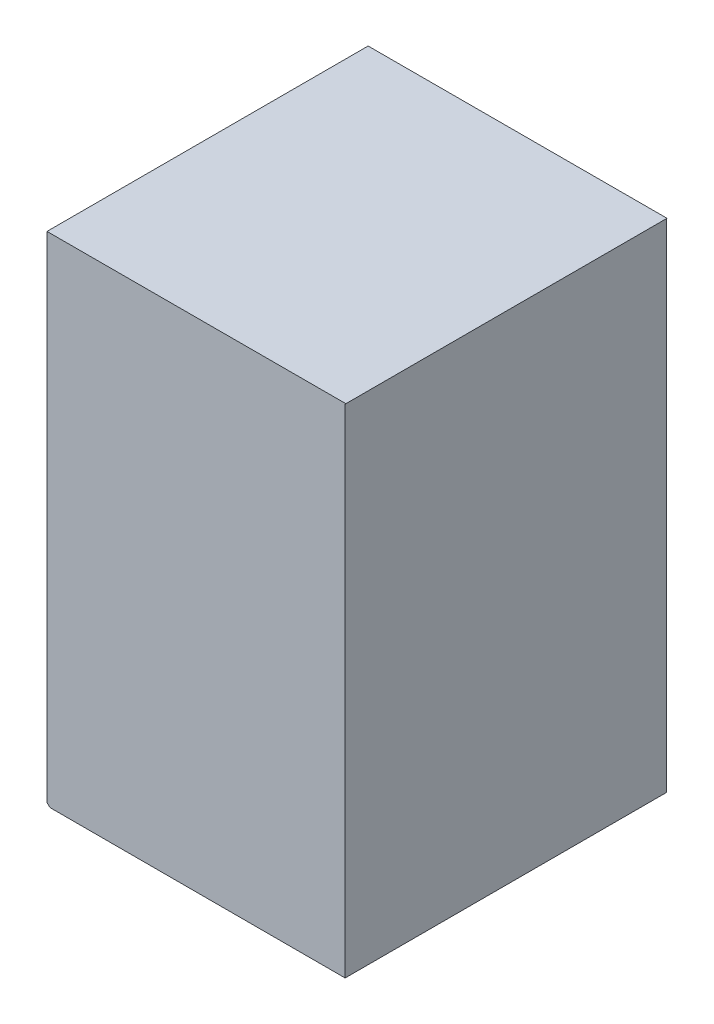
ISO-10303-21;
HEADER;
FILE_DESCRIPTION(('STEP AP214'),'2;1');
FILE_NAME('part.step','',(''),(''),'','','');
FILE_SCHEMA(('AUTOMOTIVE_DESIGN { 1 0 10303 214 1 1 1 1 }'));
ENDSEC;
DATA;
#1=APPLICATION_CONTEXT('core data for automotive mechanical design processes');
#2=APPLICATION_PROTOCOL_DEFINITION('international standard','automotive_design',2000,#1);
#3=PRODUCT_CONTEXT('',#1,'mechanical');
#4=PRODUCT('Part','Part','',(#3));
#5=PRODUCT_RELATED_PRODUCT_CATEGORY('part','',(#4));
#6=PRODUCT_DEFINITION_FORMATION('','',#4);
#7=PRODUCT_DEFINITION_CONTEXT('part definition',#1,'design');
#8=PRODUCT_DEFINITION('design','',#6,#7);
#9=PRODUCT_DEFINITION_SHAPE('','',#8);
#10=(LENGTH_UNIT() NAMED_UNIT(*) SI_UNIT(.MILLI.,.METRE.));
#11=(NAMED_UNIT(*) PLANE_ANGLE_UNIT() SI_UNIT($,.RADIAN.));
#12=(NAMED_UNIT(*) SI_UNIT($,.STERADIAN.) SOLID_ANGLE_UNIT());
#13=UNCERTAINTY_MEASURE_WITH_UNIT(LENGTH_MEASURE(1.E-05),#10,'distance_accuracy_value','');
#14=(GEOMETRIC_REPRESENTATION_CONTEXT(3) GLOBAL_UNCERTAINTY_ASSIGNED_CONTEXT((#13)) GLOBAL_UNIT_ASSIGNED_CONTEXT((#10,
#11,#12)) REPRESENTATION_CONTEXT('',''));
#15=CARTESIAN_POINT('',(0.,0.,0.));
#16=DIRECTION('',(0.,0.,1.));
#17=DIRECTION('',(1.,0.,0.));
#18=AXIS2_PLACEMENT_3D('',#15,#16,#17);
#19=CARTESIAN_POINT('',(-0.59299856,-1.00749862,0.));
#20=DIRECTION('',(-0.707106781187048,-0.707106781186048,0.));
#21=DIRECTION('',(0.707106781186048,-0.707106781187048,0.));
#22=AXIS2_PLACEMENT_3D('',#19,#20,#21);
#23=PLANE('',#22);
#24=DIRECTION('',(0.,0.,1.));
#25=VECTOR('',#24,1.);
#26=CARTESIAN_POINT('',(-0.60500006,-0.99549712,0.));
#27=LINE('',#26,#25);
#28=CARTESIAN_POINT('',(-0.605000059999996,-0.995497119999996,0.));
#29=VERTEX_POINT('',#28);
#30=CARTESIAN_POINT('',(-0.605000059999996,-0.995497119999996,1.3));
#31=VERTEX_POINT('',#30);
#32=EDGE_CURVE('E103',#29,#31,#27,.T.);
#33=ORIENTED_EDGE('',*,*,#32,.F.);
#34=DIRECTION('',(0.707106781186048,-0.707106781187048,0.));
#35=VECTOR('',#34,1.);
#36=CARTESIAN_POINT('',(-0.59299856,-1.00749862,0.));
#37=LINE('',#36,#35);
#38=CARTESIAN_POINT('',(-0.59299856,-1.00749862,0.));
#39=VERTEX_POINT('',#38);
#40=EDGE_CURVE('E20',#29,#39,#37,.T.);
#41=ORIENTED_EDGE('',*,*,#40,.T.);
#42=DIRECTION('',(0.,0.,-1.));
#43=VECTOR('',#42,1.);
#44=CARTESIAN_POINT('',(-0.59299856,-1.00749862,0.));
#45=LINE('',#44,#43);
#46=CARTESIAN_POINT('',(-0.59299856,-1.00749862,1.3));
#47=VERTEX_POINT('',#46);
#48=EDGE_CURVE('E106',#47,#39,#45,.T.);
#49=ORIENTED_EDGE('',*,*,#48,.F.);
#50=DIRECTION('',(-0.707106781186547,0.707106781186547,0.));
#51=VECTOR('',#50,1.);
#52=CARTESIAN_POINT('',(-0.59299856,-1.00749862,1.3));
#53=LINE('',#52,#51);
#54=EDGE_CURVE('E68',#47,#31,#53,.T.);
#55=ORIENTED_EDGE('',*,*,#54,.T.);
#56=EDGE_LOOP('',(#33,#41,#49,#55));
#57=FACE_BOUND('',#56,.T.);
#58=ADVANCED_FACE('F17',(#57),#23,.T.);
#59=CARTESIAN_POINT('',(-0.60500006,-0.99549712,0.));
#60=DIRECTION('',(-1.,0.,0.));
#61=DIRECTION('',(0.,0.,1.));
#62=AXIS2_PLACEMENT_3D('',#59,#60,#61);
#63=PLANE('',#62);
#64=DIRECTION('',(0.,0.,1.));
#65=VECTOR('',#64,1.);
#66=CARTESIAN_POINT('',(-0.60500006,1.0065004,0.));
#67=LINE('',#66,#65);
#68=CARTESIAN_POINT('',(-0.60500006,1.0065004,0.));
#69=VERTEX_POINT('',#68);
#70=CARTESIAN_POINT('',(-0.60500006,1.0065004,1.3));
#71=VERTEX_POINT('',#70);
#72=EDGE_CURVE('E84',#69,#71,#67,.T.);
#73=ORIENTED_EDGE('',*,*,#72,.F.);
#74=DIRECTION('',(0.,1.,0.));
#75=VECTOR('',#74,1.);
#76=CARTESIAN_POINT('',(-0.60500006,1.00750116,0.));
#77=LINE('',#76,#75);
#78=EDGE_CURVE('E114',#29,#69,#77,.T.);
#79=ORIENTED_EDGE('',*,*,#78,.F.);
#80=ORIENTED_EDGE('',*,*,#32,.T.);
#81=DIRECTION('',(0.,1.,0.));
#82=VECTOR('',#81,1.);
#83=CARTESIAN_POINT('',(-0.60500006,1.00750116,1.3));
#84=LINE('',#83,#82);
#85=EDGE_CURVE('E93',#31,#71,#84,.T.);
#86=ORIENTED_EDGE('',*,*,#85,.T.);
#87=EDGE_LOOP('',(#73,#79,#80,#86));
#88=FACE_BOUND('',#87,.T.);
#89=ADVANCED_FACE('F121',(#88),#63,.T.);
#90=CARTESIAN_POINT('',(-0.60500006,1.0065004,0.));
#91=DIRECTION('',(-0.000827074015269989,0.999999657974228,0.));
#92=DIRECTION('',(-0.999999657974228,-0.000827074015269989,0.));
#93=AXIS2_PLACEMENT_3D('',#90,#91,#92);
#94=PLANE('',#93);
#95=DIRECTION('',(0.,0.,1.));
#96=VECTOR('',#95,1.);
#97=CARTESIAN_POINT('',(0.60500006,1.00750116,0.));
#98=LINE('',#97,#96);
#99=CARTESIAN_POINT('',(0.60500006,1.00750116,0.));
#100=VERTEX_POINT('',#99);
#101=CARTESIAN_POINT('',(0.60500006,1.00750116,1.3));
#102=VERTEX_POINT('',#101);
#103=EDGE_CURVE('E73',#100,#102,#98,.T.);
#104=ORIENTED_EDGE('',*,*,#103,.F.);
#105=DIRECTION('',(0.999999657974228,0.000827074015260596,0.));
#106=VECTOR('',#105,1.);
#107=CARTESIAN_POINT('',(-0.60500006,1.0065004,0.));
#108=LINE('',#107,#106);
#109=EDGE_CURVE('E116',#69,#100,#108,.T.);
#110=ORIENTED_EDGE('',*,*,#109,.F.);
#111=ORIENTED_EDGE('',*,*,#72,.T.);
#112=DIRECTION('',(0.999999657974228,0.000827074015260596,0.));
#113=VECTOR('',#112,1.);
#114=CARTESIAN_POINT('',(-0.60500006,1.0065004,1.3));
#115=LINE('',#114,#113);
#116=EDGE_CURVE('E88',#71,#102,#115,.T.);
#117=ORIENTED_EDGE('',*,*,#116,.T.);
#118=EDGE_LOOP('',(#104,#110,#111,#117));
#119=FACE_BOUND('',#118,.T.);
#120=ADVANCED_FACE('F89',(#119),#94,.T.);
#121=CARTESIAN_POINT('',(0.60500006,1.00750116,0.));
#122=DIRECTION('',(0.707106781186548,-0.707106781186548,0.));
#123=DIRECTION('',(0.707106781186548,0.707106781186548,0.));
#124=AXIS2_PLACEMENT_3D('',#121,#122,#123);
#125=PLANE('',#124);
#126=DIRECTION('',(0.,0.,-1.));
#127=VECTOR('',#126,1.);
#128=CARTESIAN_POINT('',(0.60200032,1.00450142,0.));
#129=LINE('',#128,#127);
#130=CARTESIAN_POINT('',(0.60200032,1.00450142,0.));
#131=VERTEX_POINT('',#130);
#132=CARTESIAN_POINT('',(0.60200032,1.00450142,1.3));
#133=VERTEX_POINT('',#132);
#134=EDGE_CURVE('E125',#131,#133,#129,.F.);
#135=ORIENTED_EDGE('',*,*,#134,.F.);
#136=DIRECTION('',(-0.707106781186548,-0.707106781186548,0.));
#137=VECTOR('',#136,1.);
#138=CARTESIAN_POINT('',(0.60500006,1.00750116,0.));
#139=LINE('',#138,#137);
#140=EDGE_CURVE('E80',#100,#131,#139,.T.);
#141=ORIENTED_EDGE('',*,*,#140,.F.);
#142=ORIENTED_EDGE('',*,*,#103,.T.);
#143=DIRECTION('',(-0.707106781186548,-0.707106781186548,0.));
#144=VECTOR('',#143,1.);
#145=CARTESIAN_POINT('',(0.60500006,1.00750116,1.3));
#146=LINE('',#145,#144);
#147=EDGE_CURVE('E77',#102,#133,#146,.T.);
#148=ORIENTED_EDGE('',*,*,#147,.T.);
#149=EDGE_LOOP('',(#135,#141,#142,#148));
#150=FACE_BOUND('',#149,.T.);
#151=ADVANCED_FACE('F75',(#150),#125,.T.);
#152=CARTESIAN_POINT('',(0.60500006,1.00750116,1.3));
#153=DIRECTION('',(0.,0.,-1.));
#154=DIRECTION('',(-1.,0.,0.));
#155=AXIS2_PLACEMENT_3D('',#152,#153,#154);
#156=PLANE('',#155);
#157=ORIENTED_EDGE('',*,*,#85,.F.);
#158=ORIENTED_EDGE('',*,*,#54,.F.);
#159=DIRECTION('',(1.,0.,0.));
#160=VECTOR('',#159,1.);
#161=CARTESIAN_POINT('',(0.60200032,-1.00749862,1.3));
#162=LINE('',#161,#160);
#163=CARTESIAN_POINT('',(0.60200032,-1.00749862,1.3));
#164=VERTEX_POINT('',#163);
#165=EDGE_CURVE('E92',#164,#47,#162,.F.);
#166=ORIENTED_EDGE('',*,*,#165,.F.);
#167=DIRECTION('',(0.,1.,0.));
#168=VECTOR('',#167,1.);
#169=CARTESIAN_POINT('',(0.60200032,1.00450142,1.3));
#170=LINE('',#169,#168);
#171=EDGE_CURVE('E97',#133,#164,#170,.F.);
#172=ORIENTED_EDGE('',*,*,#171,.F.);
#173=ORIENTED_EDGE('',*,*,#147,.F.);
#174=ORIENTED_EDGE('',*,*,#116,.F.);
#175=EDGE_LOOP('',(#157,#158,#166,#172,#173,#174));
#176=FACE_BOUND('',#175,.T.);
#177=ADVANCED_FACE('F95',(#176),#156,.F.);
#178=CARTESIAN_POINT('',(0.60200032,-1.00749862,0.));
#179=DIRECTION('',(0.,-1.,0.));
#180=DIRECTION('',(0.,0.,-1.));
#181=AXIS2_PLACEMENT_3D('',#178,#179,#180);
#182=PLANE('',#181);
#183=ORIENTED_EDGE('',*,*,#48,.T.);
#184=DIRECTION('',(-1.,0.,0.));
#185=VECTOR('',#184,1.);
#186=CARTESIAN_POINT('',(0.60500006,-1.00749862,0.));
#187=LINE('',#186,#185);
#188=CARTESIAN_POINT('',(0.60200032,-1.00749862,0.));
#189=VERTEX_POINT('',#188);
#190=EDGE_CURVE('E35',#189,#39,#187,.T.);
#191=ORIENTED_EDGE('',*,*,#190,.F.);
#192=DIRECTION('',(0.,0.,-1.));
#193=VECTOR('',#192,1.);
#194=CARTESIAN_POINT('',(0.60200032,-1.00749862,0.));
#195=LINE('',#194,#193);
#196=EDGE_CURVE('E26',#164,#189,#195,.T.);
#197=ORIENTED_EDGE('',*,*,#196,.F.);
#198=ORIENTED_EDGE('',*,*,#165,.T.);
#199=EDGE_LOOP('',(#183,#191,#197,#198));
#200=FACE_BOUND('',#199,.T.);
#201=ADVANCED_FACE('F110',(#200),#182,.T.);
#202=CARTESIAN_POINT('',(0.60500006,1.00750116,0.));
#203=DIRECTION('',(0.,0.,-1.));
#204=DIRECTION('',(-1.,0.,0.));
#205=AXIS2_PLACEMENT_3D('',#202,#203,#204);
#206=PLANE('',#205);
#207=ORIENTED_EDGE('',*,*,#78,.T.);
#208=ORIENTED_EDGE('',*,*,#109,.T.);
#209=ORIENTED_EDGE('',*,*,#140,.T.);
#210=DIRECTION('',(0.,1.,0.));
#211=VECTOR('',#210,1.);
#212=CARTESIAN_POINT('',(0.60200032,1.00450142,0.));
#213=LINE('',#212,#211);
#214=EDGE_CURVE('E11',#189,#131,#213,.T.);
#215=ORIENTED_EDGE('',*,*,#214,.F.);
#216=ORIENTED_EDGE('',*,*,#190,.T.);
#217=ORIENTED_EDGE('',*,*,#40,.F.);
#218=EDGE_LOOP('',(#207,#208,#209,#215,#216,#217));
#219=FACE_BOUND('',#218,.T.);
#220=ADVANCED_FACE('F112',(#219),#206,.T.);
#221=CARTESIAN_POINT('',(0.60200032,1.00450142,0.));
#222=DIRECTION('',(1.,0.,0.));
#223=DIRECTION('',(0.,0.,-1.));
#224=AXIS2_PLACEMENT_3D('',#221,#222,#223);
#225=PLANE('',#224);
#226=ORIENTED_EDGE('',*,*,#196,.T.);
#227=ORIENTED_EDGE('',*,*,#214,.T.);
#228=ORIENTED_EDGE('',*,*,#134,.T.);
#229=ORIENTED_EDGE('',*,*,#171,.T.);
#230=EDGE_LOOP('',(#226,#227,#228,#229));
#231=FACE_BOUND('',#230,.T.);
#232=ADVANCED_FACE('F124',(#231),#225,.T.);
#233=CLOSED_SHELL('',(#58,#89,#120,#151,#177,#201,#220,#232));
#234=MANIFOLD_SOLID_BREP('B1',#233);
#235=ADVANCED_BREP_SHAPE_REPRESENTATION('',(#18,#234),#14);
#236=SHAPE_DEFINITION_REPRESENTATION(#9,#235);
ENDSEC;
END-ISO-10303-21;
